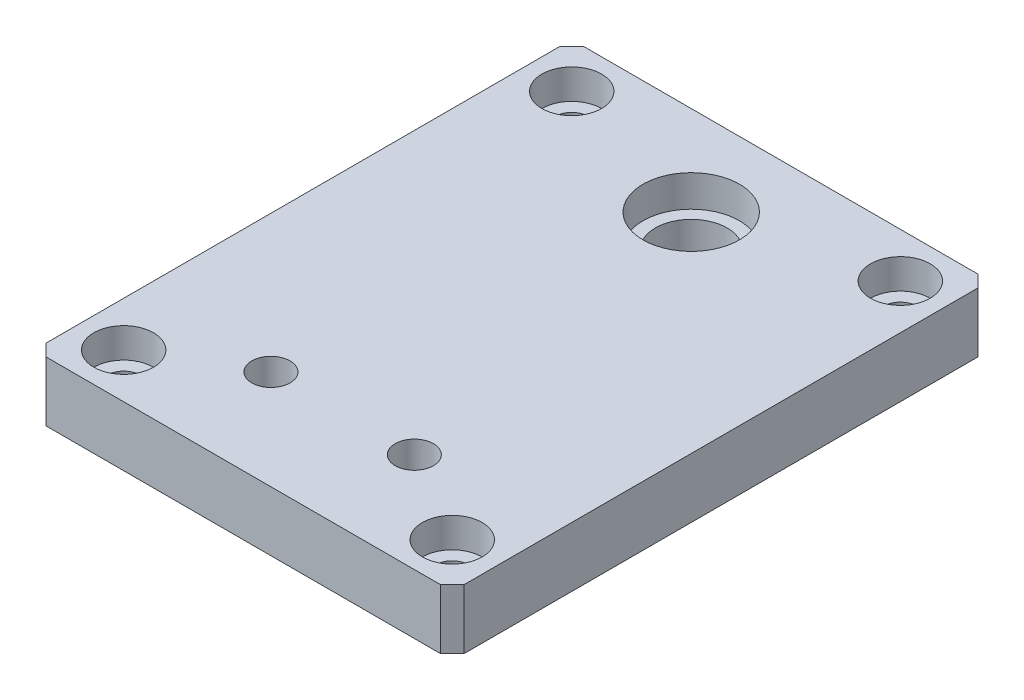
ISO-10303-21;
HEADER;
FILE_DESCRIPTION(('STEP AP214'),'2;1');
FILE_NAME('part.step','',(''),(''),'','','');
FILE_SCHEMA(('AUTOMOTIVE_DESIGN { 1 0 10303 214 1 1 1 1 }'));
ENDSEC;
DATA;
#1=APPLICATION_CONTEXT('core data for automotive mechanical design processes');
#2=APPLICATION_PROTOCOL_DEFINITION('international standard','automotive_design',2000,#1);
#3=PRODUCT_CONTEXT('',#1,'mechanical');
#4=PRODUCT('Part','Part','',(#3));
#5=PRODUCT_RELATED_PRODUCT_CATEGORY('part','',(#4));
#6=PRODUCT_DEFINITION_FORMATION('','',#4);
#7=PRODUCT_DEFINITION_CONTEXT('part definition',#1,'design');
#8=PRODUCT_DEFINITION('design','',#6,#7);
#9=PRODUCT_DEFINITION_SHAPE('','',#8);
#10=(LENGTH_UNIT() NAMED_UNIT(*) SI_UNIT(.MILLI.,.METRE.));
#11=(NAMED_UNIT(*) PLANE_ANGLE_UNIT() SI_UNIT($,.RADIAN.));
#12=(NAMED_UNIT(*) SI_UNIT($,.STERADIAN.) SOLID_ANGLE_UNIT());
#13=UNCERTAINTY_MEASURE_WITH_UNIT(LENGTH_MEASURE(1.E-05),#10,'distance_accuracy_value','');
#14=(GEOMETRIC_REPRESENTATION_CONTEXT(3) GLOBAL_UNCERTAINTY_ASSIGNED_CONTEXT((#13)) GLOBAL_UNIT_ASSIGNED_CONTEXT((#10,
#11,#12)) REPRESENTATION_CONTEXT('',''));
#15=CARTESIAN_POINT('',(0.,0.,0.));
#16=DIRECTION('',(0.,0.,1.));
#17=DIRECTION('',(1.,0.,0.));
#18=AXIS2_PLACEMENT_3D('',#15,#16,#17);
#19=CARTESIAN_POINT('',(35.,10.,45.));
#20=DIRECTION('',(-1.,0.,0.));
#21=DIRECTION('',(0.,0.,1.));
#22=AXIS2_PLACEMENT_3D('',#19,#20,#21);
#23=PLANE('',#22);
#24=DIRECTION('',(0.,0.,-1.));
#25=VECTOR('',#24,1.);
#26=CARTESIAN_POINT('',(35.,10.,45.));
#27=LINE('',#26,#25);
#28=CARTESIAN_POINT('',(35.,10.,43.));
#29=VERTEX_POINT('',#28);
#30=CARTESIAN_POINT('',(35.,10.,-43.));
#31=VERTEX_POINT('',#30);
#32=EDGE_CURVE('E127',#29,#31,#27,.T.);
#33=ORIENTED_EDGE('',*,*,#32,.F.);
#34=DIRECTION('',(0.,-1.,0.));
#35=VECTOR('',#34,1.);
#36=CARTESIAN_POINT('',(35.,10.,43.));
#37=LINE('',#36,#35);
#38=CARTESIAN_POINT('',(35.,0.,43.));
#39=VERTEX_POINT('',#38);
#40=EDGE_CURVE('E112',#29,#39,#37,.T.);
#41=ORIENTED_EDGE('',*,*,#40,.T.);
#42=DIRECTION('',(0.,0.,-1.));
#43=VECTOR('',#42,1.);
#44=CARTESIAN_POINT('',(35.,0.,45.));
#45=LINE('',#44,#43);
#46=CARTESIAN_POINT('',(35.,0.,-43.));
#47=VERTEX_POINT('',#46);
#48=EDGE_CURVE('E124',#39,#47,#45,.T.);
#49=ORIENTED_EDGE('',*,*,#48,.T.);
#50=DIRECTION('',(0.,1.,0.));
#51=VECTOR('',#50,1.);
#52=CARTESIAN_POINT('',(35.,10.,-43.));
#53=LINE('',#52,#51);
#54=EDGE_CURVE('E129',#47,#31,#53,.T.);
#55=ORIENTED_EDGE('',*,*,#54,.T.);
#56=EDGE_LOOP('',(#33,#41,#49,#55));
#57=FACE_BOUND('',#56,.T.);
#58=ADVANCED_FACE('F41',(#57),#23,.F.);
#59=CARTESIAN_POINT('',(-35.,10.,-45.));
#60=DIRECTION('',(0.,0.,1.));
#61=DIRECTION('',(1.,0.,0.));
#62=AXIS2_PLACEMENT_3D('',#59,#60,#61);
#63=PLANE('',#62);
#64=DIRECTION('',(-1.,0.,0.));
#65=VECTOR('',#64,1.);
#66=CARTESIAN_POINT('',(-35.,10.,-45.));
#67=LINE('',#66,#65);
#68=CARTESIAN_POINT('',(33.,10.,-45.));
#69=VERTEX_POINT('',#68);
#70=CARTESIAN_POINT('',(-33.,10.,-45.));
#71=VERTEX_POINT('',#70);
#72=EDGE_CURVE('E173',#69,#71,#67,.T.);
#73=ORIENTED_EDGE('',*,*,#72,.F.);
#74=DIRECTION('',(0.,-1.,0.));
#75=VECTOR('',#74,1.);
#76=CARTESIAN_POINT('',(33.,10.,-45.));
#77=LINE('',#76,#75);
#78=CARTESIAN_POINT('',(33.,0.,-45.));
#79=VERTEX_POINT('',#78);
#80=EDGE_CURVE('E166',#69,#79,#77,.T.);
#81=ORIENTED_EDGE('',*,*,#80,.T.);
#82=DIRECTION('',(-1.,0.,0.));
#83=VECTOR('',#82,1.);
#84=CARTESIAN_POINT('',(-35.,0.,-45.));
#85=LINE('',#84,#83);
#86=CARTESIAN_POINT('',(-33.,0.,-45.));
#87=VERTEX_POINT('',#86);
#88=EDGE_CURVE('E133',#79,#87,#85,.T.);
#89=ORIENTED_EDGE('',*,*,#88,.T.);
#90=DIRECTION('',(0.,1.,0.));
#91=VECTOR('',#90,1.);
#92=CARTESIAN_POINT('',(-33.,10.,-45.));
#93=LINE('',#92,#91);
#94=EDGE_CURVE('E164',#87,#71,#93,.T.);
#95=ORIENTED_EDGE('',*,*,#94,.T.);
#96=EDGE_LOOP('',(#73,#81,#89,#95));
#97=FACE_BOUND('',#96,.T.);
#98=ADVANCED_FACE('F171',(#97),#63,.F.);
#99=CARTESIAN_POINT('',(-35.,10.,45.));
#100=DIRECTION('',(1.,0.,0.));
#101=DIRECTION('',(0.,0.,-1.));
#102=AXIS2_PLACEMENT_3D('',#99,#100,#101);
#103=PLANE('',#102);
#104=DIRECTION('',(0.,0.,1.));
#105=VECTOR('',#104,1.);
#106=CARTESIAN_POINT('',(-35.,10.,45.));
#107=LINE('',#106,#105);
#108=CARTESIAN_POINT('',(-35.,10.,-43.));
#109=VERTEX_POINT('',#108);
#110=CARTESIAN_POINT('',(-35.,10.,43.));
#111=VERTEX_POINT('',#110);
#112=EDGE_CURVE('E181',#109,#111,#107,.T.);
#113=ORIENTED_EDGE('',*,*,#112,.F.);
#114=DIRECTION('',(0.,-1.,0.));
#115=VECTOR('',#114,1.);
#116=CARTESIAN_POINT('',(-35.,10.,-43.));
#117=LINE('',#116,#115);
#118=CARTESIAN_POINT('',(-35.,0.,-43.));
#119=VERTEX_POINT('',#118);
#120=EDGE_CURVE('E11',#109,#119,#117,.T.);
#121=ORIENTED_EDGE('',*,*,#120,.T.);
#122=DIRECTION('',(0.,0.,1.));
#123=VECTOR('',#122,1.);
#124=CARTESIAN_POINT('',(-35.,0.,45.));
#125=LINE('',#124,#123);
#126=CARTESIAN_POINT('',(-35.,0.,43.));
#127=VERTEX_POINT('',#126);
#128=EDGE_CURVE('E137',#119,#127,#125,.T.);
#129=ORIENTED_EDGE('',*,*,#128,.T.);
#130=DIRECTION('',(0.,1.,0.));
#131=VECTOR('',#130,1.);
#132=CARTESIAN_POINT('',(-35.,10.,43.));
#133=LINE('',#132,#131);
#134=EDGE_CURVE('E50',#127,#111,#133,.T.);
#135=ORIENTED_EDGE('',*,*,#134,.T.);
#136=EDGE_LOOP('',(#113,#121,#129,#135));
#137=FACE_BOUND('',#136,.T.);
#138=ADVANCED_FACE('F180',(#137),#103,.F.);
#139=CARTESIAN_POINT('',(-35.,10.,45.));
#140=DIRECTION('',(0.,0.,-1.));
#141=DIRECTION('',(-1.,0.,0.));
#142=AXIS2_PLACEMENT_3D('',#139,#140,#141);
#143=PLANE('',#142);
#144=DIRECTION('',(1.,0.,0.));
#145=VECTOR('',#144,1.);
#146=CARTESIAN_POINT('',(-35.,0.,45.));
#147=LINE('',#146,#145);
#148=CARTESIAN_POINT('',(-33.,0.,45.));
#149=VERTEX_POINT('',#148);
#150=CARTESIAN_POINT('',(33.,0.,45.));
#151=VERTEX_POINT('',#150);
#152=EDGE_CURVE('E147',#149,#151,#147,.T.);
#153=ORIENTED_EDGE('',*,*,#152,.T.);
#154=DIRECTION('',(0.,1.,0.));
#155=VECTOR('',#154,1.);
#156=CARTESIAN_POINT('',(33.,10.,45.));
#157=LINE('',#156,#155);
#158=CARTESIAN_POINT('',(33.,10.,45.));
#159=VERTEX_POINT('',#158);
#160=EDGE_CURVE('E113',#151,#159,#157,.T.);
#161=ORIENTED_EDGE('',*,*,#160,.T.);
#162=DIRECTION('',(1.,0.,0.));
#163=VECTOR('',#162,1.);
#164=CARTESIAN_POINT('',(-35.,10.,45.));
#165=LINE('',#164,#163);
#166=CARTESIAN_POINT('',(-33.,10.,45.));
#167=VERTEX_POINT('',#166);
#168=EDGE_CURVE('E143',#167,#159,#165,.T.);
#169=ORIENTED_EDGE('',*,*,#168,.F.);
#170=DIRECTION('',(0.,-1.,0.));
#171=VECTOR('',#170,1.);
#172=CARTESIAN_POINT('',(-33.,10.,45.));
#173=LINE('',#172,#171);
#174=EDGE_CURVE('E118',#167,#149,#173,.T.);
#175=ORIENTED_EDGE('',*,*,#174,.T.);
#176=EDGE_LOOP('',(#153,#161,#169,#175));
#177=FACE_BOUND('',#176,.T.);
#178=ADVANCED_FACE('F268',(#177),#143,.F.);
#179=CARTESIAN_POINT('',(0.,10.,0.));
#180=DIRECTION('',(0.,-1.,0.));
#181=DIRECTION('',(0.,0.,-1.));
#182=AXIS2_PLACEMENT_3D('',#179,#180,#181);
#183=PLANE('',#182);
#184=CARTESIAN_POINT('',(12.,10.,28.35));
#185=DIRECTION('',(0.,1.,0.));
#186=DIRECTION('',(0.,0.,1.));
#187=AXIS2_PLACEMENT_3D('',#184,#185,#186);
#188=CIRCLE('',#187,3.2);
#189=CARTESIAN_POINT('',(12.,10.,31.55));
#190=VERTEX_POINT('',#189);
#191=EDGE_CURVE('E250',#190,#190,#188,.T.);
#192=ORIENTED_EDGE('',*,*,#191,.F.);
#193=EDGE_LOOP('',(#192));
#194=FACE_BOUND('',#193,.T.);
#195=CARTESIAN_POINT('',(-12.,10.,28.35));
#196=DIRECTION('',(0.,1.,0.));
#197=DIRECTION('',(0.,0.,1.));
#198=AXIS2_PLACEMENT_3D('',#195,#196,#197);
#199=CIRCLE('',#198,3.2);
#200=CARTESIAN_POINT('',(-12.,10.,31.55));
#201=VERTEX_POINT('',#200);
#202=EDGE_CURVE('E247',#201,#201,#199,.T.);
#203=ORIENTED_EDGE('',*,*,#202,.F.);
#204=EDGE_LOOP('',(#203));
#205=FACE_BOUND('',#204,.T.);
#206=CARTESIAN_POINT('',(0.,10.,-30.));
#207=DIRECTION('',(0.,1.,0.));
#208=DIRECTION('',(0.,0.,1.));
#209=AXIS2_PLACEMENT_3D('',#206,#207,#208);
#210=CIRCLE('',#209,8.075);
#211=CARTESIAN_POINT('',(0.,10.,-21.925));
#212=VERTEX_POINT('',#211);
#213=EDGE_CURVE('E234',#212,#212,#210,.T.);
#214=ORIENTED_EDGE('',*,*,#213,.F.);
#215=EDGE_LOOP('',(#214));
#216=FACE_BOUND('',#215,.T.);
#217=CARTESIAN_POINT('',(-27.5,10.,37.5));
#218=DIRECTION('',(0.,1.,0.));
#219=DIRECTION('',(0.,0.,1.));
#220=AXIS2_PLACEMENT_3D('',#217,#218,#219);
#221=CIRCLE('',#220,5.);
#222=CARTESIAN_POINT('',(-27.5,10.,42.5));
#223=VERTEX_POINT('',#222);
#224=EDGE_CURVE('E228',#223,#223,#221,.T.);
#225=ORIENTED_EDGE('',*,*,#224,.F.);
#226=EDGE_LOOP('',(#225));
#227=FACE_BOUND('',#226,.T.);
#228=CARTESIAN_POINT('',(-27.5,10.,-37.5));
#229=DIRECTION('',(0.,1.,0.));
#230=DIRECTION('',(0.,0.,1.));
#231=AXIS2_PLACEMENT_3D('',#228,#229,#230);
#232=CIRCLE('',#231,5.);
#233=CARTESIAN_POINT('',(-27.5,10.,-32.5));
#234=VERTEX_POINT('',#233);
#235=EDGE_CURVE('E216',#234,#234,#232,.T.);
#236=ORIENTED_EDGE('',*,*,#235,.F.);
#237=EDGE_LOOP('',(#236));
#238=FACE_BOUND('',#237,.T.);
#239=CARTESIAN_POINT('',(27.5,10.,-37.5));
#240=DIRECTION('',(0.,1.,0.));
#241=DIRECTION('',(0.,0.,1.));
#242=AXIS2_PLACEMENT_3D('',#239,#240,#241);
#243=CIRCLE('',#242,5.);
#244=CARTESIAN_POINT('',(27.5,10.,-32.5));
#245=VERTEX_POINT('',#244);
#246=EDGE_CURVE('E204',#245,#245,#243,.T.);
#247=ORIENTED_EDGE('',*,*,#246,.F.);
#248=EDGE_LOOP('',(#247));
#249=FACE_BOUND('',#248,.T.);
#250=CARTESIAN_POINT('',(27.5,10.,37.5));
#251=DIRECTION('',(0.,1.,0.));
#252=DIRECTION('',(0.,0.,1.));
#253=AXIS2_PLACEMENT_3D('',#250,#251,#252);
#254=CIRCLE('',#253,5.);
#255=CARTESIAN_POINT('',(27.5,10.,42.5));
#256=VERTEX_POINT('',#255);
#257=EDGE_CURVE('E192',#256,#256,#254,.T.);
#258=ORIENTED_EDGE('',*,*,#257,.F.);
#259=EDGE_LOOP('',(#258));
#260=FACE_BOUND('',#259,.T.);
#261=ORIENTED_EDGE('',*,*,#168,.T.);
#262=DIRECTION('',(-0.70710678118655,0.,0.707106781186545));
#263=VECTOR('',#262,1.);
#264=CARTESIAN_POINT('',(35.,10.,43.));
#265=LINE('',#264,#263);
#266=EDGE_CURVE('E162',#159,#29,#265,.F.);
#267=ORIENTED_EDGE('',*,*,#266,.T.);
#268=ORIENTED_EDGE('',*,*,#32,.T.);
#269=DIRECTION('',(0.707106781186545,0.,0.70710678118655));
#270=VECTOR('',#269,1.);
#271=CARTESIAN_POINT('',(33.,10.,-45.));
#272=LINE('',#271,#270);
#273=EDGE_CURVE('E160',#31,#69,#272,.F.);
#274=ORIENTED_EDGE('',*,*,#273,.T.);
#275=ORIENTED_EDGE('',*,*,#72,.T.);
#276=DIRECTION('',(0.70710678118655,0.,-0.707106781186545));
#277=VECTOR('',#276,1.);
#278=CARTESIAN_POINT('',(-35.,10.,-43.));
#279=LINE('',#278,#277);
#280=EDGE_CURVE('E63',#71,#109,#279,.F.);
#281=ORIENTED_EDGE('',*,*,#280,.T.);
#282=ORIENTED_EDGE('',*,*,#112,.T.);
#283=DIRECTION('',(-0.707106781186545,0.,-0.70710678118655));
#284=VECTOR('',#283,1.);
#285=CARTESIAN_POINT('',(-33.,10.,45.));
#286=LINE('',#285,#284);
#287=EDGE_CURVE('E157',#111,#167,#286,.F.);
#288=ORIENTED_EDGE('',*,*,#287,.T.);
#289=EDGE_LOOP('',(#261,#267,#268,#274,#275,#281,#282,#288));
#290=FACE_BOUND('',#289,.T.);
#291=ADVANCED_FACE('F265',(#194,#205,#216,#227,#238,#249,#260,#290),#183,.F.);
#292=CARTESIAN_POINT('',(0.,0.,0.));
#293=DIRECTION('',(0.,-1.,0.));
#294=DIRECTION('',(0.,0.,-1.));
#295=AXIS2_PLACEMENT_3D('',#292,#293,#294);
#296=PLANE('',#295);
#297=CARTESIAN_POINT('',(12.,0.,28.35));
#298=DIRECTION('',(0.,1.,0.));
#299=DIRECTION('',(0.,0.,1.));
#300=AXIS2_PLACEMENT_3D('',#297,#298,#299);
#301=CIRCLE('',#300,3.2);
#302=CARTESIAN_POINT('',(12.,0.,31.55));
#303=VERTEX_POINT('',#302);
#304=EDGE_CURVE('E243',#303,#303,#301,.T.);
#305=ORIENTED_EDGE('',*,*,#304,.T.);
#306=EDGE_LOOP('',(#305));
#307=FACE_BOUND('',#306,.T.);
#308=CARTESIAN_POINT('',(-12.,0.,28.35));
#309=DIRECTION('',(0.,1.,0.));
#310=DIRECTION('',(0.,0.,1.));
#311=AXIS2_PLACEMENT_3D('',#308,#309,#310);
#312=CIRCLE('',#311,3.2);
#313=CARTESIAN_POINT('',(-12.,0.,31.55));
#314=VERTEX_POINT('',#313);
#315=EDGE_CURVE('E244',#314,#314,#312,.T.);
#316=ORIENTED_EDGE('',*,*,#315,.T.);
#317=EDGE_LOOP('',(#316));
#318=FACE_BOUND('',#317,.T.);
#319=CARTESIAN_POINT('',(0.,0.,-30.));
#320=DIRECTION('',(0.,1.,0.));
#321=DIRECTION('',(0.,0.,1.));
#322=AXIS2_PLACEMENT_3D('',#319,#320,#321);
#323=CIRCLE('',#322,6.);
#324=CARTESIAN_POINT('',(0.,0.,-24.));
#325=VERTEX_POINT('',#324);
#326=EDGE_CURVE('E237',#325,#325,#323,.T.);
#327=ORIENTED_EDGE('',*,*,#326,.T.);
#328=EDGE_LOOP('',(#327));
#329=FACE_BOUND('',#328,.T.);
#330=CARTESIAN_POINT('',(-27.5,0.,37.5));
#331=DIRECTION('',(0.,1.,0.));
#332=DIRECTION('',(0.,0.,1.));
#333=AXIS2_PLACEMENT_3D('',#330,#331,#332);
#334=CIRCLE('',#333,2.75000000000001);
#335=CARTESIAN_POINT('',(-27.5,0.,40.25));
#336=VERTEX_POINT('',#335);
#337=EDGE_CURVE('E219',#336,#336,#334,.T.);
#338=ORIENTED_EDGE('',*,*,#337,.T.);
#339=EDGE_LOOP('',(#338));
#340=FACE_BOUND('',#339,.T.);
#341=CARTESIAN_POINT('',(-27.5,0.,-37.5));
#342=DIRECTION('',(0.,1.,0.));
#343=DIRECTION('',(0.,0.,1.));
#344=AXIS2_PLACEMENT_3D('',#341,#342,#343);
#345=CIRCLE('',#344,2.75000000000001);
#346=CARTESIAN_POINT('',(-27.5,0.,-34.75));
#347=VERTEX_POINT('',#346);
#348=EDGE_CURVE('E207',#347,#347,#345,.T.);
#349=ORIENTED_EDGE('',*,*,#348,.T.);
#350=EDGE_LOOP('',(#349));
#351=FACE_BOUND('',#350,.T.);
#352=CARTESIAN_POINT('',(27.5,0.,-37.5));
#353=DIRECTION('',(0.,1.,0.));
#354=DIRECTION('',(0.,0.,1.));
#355=AXIS2_PLACEMENT_3D('',#352,#353,#354);
#356=CIRCLE('',#355,2.75000000000001);
#357=CARTESIAN_POINT('',(27.5,0.,-34.75));
#358=VERTEX_POINT('',#357);
#359=EDGE_CURVE('E195',#358,#358,#356,.T.);
#360=ORIENTED_EDGE('',*,*,#359,.T.);
#361=EDGE_LOOP('',(#360));
#362=FACE_BOUND('',#361,.T.);
#363=CARTESIAN_POINT('',(27.5,0.,37.5));
#364=DIRECTION('',(0.,1.,0.));
#365=DIRECTION('',(0.,0.,1.));
#366=AXIS2_PLACEMENT_3D('',#363,#364,#365);
#367=CIRCLE('',#366,2.75000000000001);
#368=CARTESIAN_POINT('',(27.5,0.,40.25));
#369=VERTEX_POINT('',#368);
#370=EDGE_CURVE('E134',#369,#369,#367,.T.);
#371=ORIENTED_EDGE('',*,*,#370,.T.);
#372=EDGE_LOOP('',(#371));
#373=FACE_BOUND('',#372,.T.);
#374=ORIENTED_EDGE('',*,*,#48,.F.);
#375=DIRECTION('',(0.70710678118655,0.,-0.707106781186545));
#376=VECTOR('',#375,1.);
#377=CARTESIAN_POINT('',(38.9999999999999,0.,39.0000000000001));
#378=LINE('',#377,#376);
#379=EDGE_CURVE('E108',#39,#151,#378,.F.);
#380=ORIENTED_EDGE('',*,*,#379,.T.);
#381=ORIENTED_EDGE('',*,*,#152,.F.);
#382=DIRECTION('',(0.707106781186545,0.,0.70710678118655));
#383=VECTOR('',#382,1.);
#384=CARTESIAN_POINT('',(-39.0000000000001,0.,38.9999999999998));
#385=LINE('',#384,#383);
#386=EDGE_CURVE('E128',#149,#127,#385,.F.);
#387=ORIENTED_EDGE('',*,*,#386,.T.);
#388=ORIENTED_EDGE('',*,*,#128,.F.);
#389=DIRECTION('',(-0.70710678118655,0.,0.707106781186545));
#390=VECTOR('',#389,1.);
#391=CARTESIAN_POINT('',(-38.9999999999999,0.,-39.0000000000001));
#392=LINE('',#391,#390);
#393=EDGE_CURVE('E151',#119,#87,#392,.F.);
#394=ORIENTED_EDGE('',*,*,#393,.T.);
#395=ORIENTED_EDGE('',*,*,#88,.F.);
#396=DIRECTION('',(-0.707106781186545,0.,-0.70710678118655));
#397=VECTOR('',#396,1.);
#398=CARTESIAN_POINT('',(39.0000000000001,0.,-38.9999999999999));
#399=LINE('',#398,#397);
#400=EDGE_CURVE('E119',#79,#47,#399,.F.);
#401=ORIENTED_EDGE('',*,*,#400,.T.);
#402=EDGE_LOOP('',(#374,#380,#381,#387,#388,#394,#395,#401));
#403=FACE_BOUND('',#402,.T.);
#404=ADVANCED_FACE('F131',(#307,#318,#329,#340,#351,#362,#373,#403),#296,.T.);
#405=CARTESIAN_POINT('',(27.5,10.,37.5));
#406=DIRECTION('',(0.,1.,0.));
#407=DIRECTION('',(0.,0.,1.));
#408=AXIS2_PLACEMENT_3D('',#405,#406,#407);
#409=CYLINDRICAL_SURFACE('',#408,2.75);
#410=ORIENTED_EDGE('',*,*,#370,.F.);
#411=EDGE_LOOP('',(#410));
#412=FACE_BOUND('',#411,.T.);
#413=CARTESIAN_POINT('',(27.5,5.,37.5));
#414=DIRECTION('',(0.,1.,0.));
#415=DIRECTION('',(0.,0.,1.));
#416=AXIS2_PLACEMENT_3D('',#413,#414,#415);
#417=CIRCLE('',#416,2.75);
#418=CARTESIAN_POINT('',(27.5,5.,40.25));
#419=VERTEX_POINT('',#418);
#420=EDGE_CURVE('E140',#419,#419,#417,.T.);
#421=ORIENTED_EDGE('',*,*,#420,.T.);
#422=EDGE_LOOP('',(#421));
#423=FACE_BOUND('',#422,.T.);
#424=ADVANCED_FACE('F471',(#412,#423),#409,.F.);
#425=CARTESIAN_POINT('',(30.25,5.,37.5));
#426=DIRECTION('',(0.,-1.,0.));
#427=DIRECTION('',(0.,0.,-1.));
#428=AXIS2_PLACEMENT_3D('',#425,#426,#427);
#429=PLANE('',#428);
#430=ORIENTED_EDGE('',*,*,#420,.F.);
#431=EDGE_LOOP('',(#430));
#432=FACE_BOUND('',#431,.T.);
#433=CARTESIAN_POINT('',(27.5,5.,37.5));
#434=DIRECTION('',(0.,1.,0.));
#435=DIRECTION('',(0.,0.,1.));
#436=AXIS2_PLACEMENT_3D('',#433,#434,#435);
#437=CIRCLE('',#436,5.);
#438=CARTESIAN_POINT('',(27.5,5.,42.5));
#439=VERTEX_POINT('',#438);
#440=EDGE_CURVE('E189',#439,#439,#437,.T.);
#441=ORIENTED_EDGE('',*,*,#440,.T.);
#442=EDGE_LOOP('',(#441));
#443=FACE_BOUND('',#442,.T.);
#444=ADVANCED_FACE('F462',(#432,#443),#429,.F.);
#445=CARTESIAN_POINT('',(27.5,10.,37.5));
#446=DIRECTION('',(0.,1.,0.));
#447=DIRECTION('',(0.,0.,1.));
#448=AXIS2_PLACEMENT_3D('',#445,#446,#447);
#449=CYLINDRICAL_SURFACE('',#448,5.);
#450=ORIENTED_EDGE('',*,*,#440,.F.);
#451=EDGE_LOOP('',(#450));
#452=FACE_BOUND('',#451,.T.);
#453=ORIENTED_EDGE('',*,*,#257,.T.);
#454=EDGE_LOOP('',(#453));
#455=FACE_BOUND('',#454,.T.);
#456=ADVANCED_FACE('F453',(#452,#455),#449,.F.);
#457=CARTESIAN_POINT('',(27.5,10.,-37.5));
#458=DIRECTION('',(0.,1.,0.));
#459=DIRECTION('',(0.,0.,1.));
#460=AXIS2_PLACEMENT_3D('',#457,#458,#459);
#461=CYLINDRICAL_SURFACE('',#460,2.75);
#462=ORIENTED_EDGE('',*,*,#359,.F.);
#463=EDGE_LOOP('',(#462));
#464=FACE_BOUND('',#463,.T.);
#465=CARTESIAN_POINT('',(27.5,5.,-37.5));
#466=DIRECTION('',(0.,1.,0.));
#467=DIRECTION('',(0.,0.,1.));
#468=AXIS2_PLACEMENT_3D('',#465,#466,#467);
#469=CIRCLE('',#468,2.75);
#470=CARTESIAN_POINT('',(27.5,5.,-34.75));
#471=VERTEX_POINT('',#470);
#472=EDGE_CURVE('E198',#471,#471,#469,.T.);
#473=ORIENTED_EDGE('',*,*,#472,.T.);
#474=EDGE_LOOP('',(#473));
#475=FACE_BOUND('',#474,.T.);
#476=ADVANCED_FACE('F444',(#464,#475),#461,.F.);
#477=CARTESIAN_POINT('',(30.25,5.,-37.5));
#478=DIRECTION('',(0.,-1.,0.));
#479=DIRECTION('',(0.,0.,-1.));
#480=AXIS2_PLACEMENT_3D('',#477,#478,#479);
#481=PLANE('',#480);
#482=ORIENTED_EDGE('',*,*,#472,.F.);
#483=EDGE_LOOP('',(#482));
#484=FACE_BOUND('',#483,.T.);
#485=CARTESIAN_POINT('',(27.5,5.,-37.5));
#486=DIRECTION('',(0.,1.,0.));
#487=DIRECTION('',(0.,0.,1.));
#488=AXIS2_PLACEMENT_3D('',#485,#486,#487);
#489=CIRCLE('',#488,5.);
#490=CARTESIAN_POINT('',(27.5,5.,-32.5));
#491=VERTEX_POINT('',#490);
#492=EDGE_CURVE('E201',#491,#491,#489,.T.);
#493=ORIENTED_EDGE('',*,*,#492,.T.);
#494=EDGE_LOOP('',(#493));
#495=FACE_BOUND('',#494,.T.);
#496=ADVANCED_FACE('F435',(#484,#495),#481,.F.);
#497=CARTESIAN_POINT('',(27.5,10.,-37.5));
#498=DIRECTION('',(0.,1.,0.));
#499=DIRECTION('',(0.,0.,1.));
#500=AXIS2_PLACEMENT_3D('',#497,#498,#499);
#501=CYLINDRICAL_SURFACE('',#500,5.);
#502=ORIENTED_EDGE('',*,*,#492,.F.);
#503=EDGE_LOOP('',(#502));
#504=FACE_BOUND('',#503,.T.);
#505=ORIENTED_EDGE('',*,*,#246,.T.);
#506=EDGE_LOOP('',(#505));
#507=FACE_BOUND('',#506,.T.);
#508=ADVANCED_FACE('F426',(#504,#507),#501,.F.);
#509=CARTESIAN_POINT('',(-27.5,10.,-37.5));
#510=DIRECTION('',(0.,1.,0.));
#511=DIRECTION('',(0.,0.,1.));
#512=AXIS2_PLACEMENT_3D('',#509,#510,#511);
#513=CYLINDRICAL_SURFACE('',#512,2.75);
#514=ORIENTED_EDGE('',*,*,#348,.F.);
#515=EDGE_LOOP('',(#514));
#516=FACE_BOUND('',#515,.T.);
#517=CARTESIAN_POINT('',(-27.5,5.,-37.5));
#518=DIRECTION('',(0.,1.,0.));
#519=DIRECTION('',(0.,0.,1.));
#520=AXIS2_PLACEMENT_3D('',#517,#518,#519);
#521=CIRCLE('',#520,2.75);
#522=CARTESIAN_POINT('',(-27.5,5.,-34.75));
#523=VERTEX_POINT('',#522);
#524=EDGE_CURVE('E210',#523,#523,#521,.T.);
#525=ORIENTED_EDGE('',*,*,#524,.T.);
#526=EDGE_LOOP('',(#525));
#527=FACE_BOUND('',#526,.T.);
#528=ADVANCED_FACE('F417',(#516,#527),#513,.F.);
#529=CARTESIAN_POINT('',(-24.75,5.,-37.5));
#530=DIRECTION('',(0.,-1.,0.));
#531=DIRECTION('',(0.,0.,-1.));
#532=AXIS2_PLACEMENT_3D('',#529,#530,#531);
#533=PLANE('',#532);
#534=ORIENTED_EDGE('',*,*,#524,.F.);
#535=EDGE_LOOP('',(#534));
#536=FACE_BOUND('',#535,.T.);
#537=CARTESIAN_POINT('',(-27.5,5.,-37.5));
#538=DIRECTION('',(0.,1.,0.));
#539=DIRECTION('',(0.,0.,1.));
#540=AXIS2_PLACEMENT_3D('',#537,#538,#539);
#541=CIRCLE('',#540,5.);
#542=CARTESIAN_POINT('',(-27.5,5.,-32.5));
#543=VERTEX_POINT('',#542);
#544=EDGE_CURVE('E213',#543,#543,#541,.T.);
#545=ORIENTED_EDGE('',*,*,#544,.T.);
#546=EDGE_LOOP('',(#545));
#547=FACE_BOUND('',#546,.T.);
#548=ADVANCED_FACE('F408',(#536,#547),#533,.F.);
#549=CARTESIAN_POINT('',(-27.5,10.,-37.5));
#550=DIRECTION('',(0.,1.,0.));
#551=DIRECTION('',(0.,0.,1.));
#552=AXIS2_PLACEMENT_3D('',#549,#550,#551);
#553=CYLINDRICAL_SURFACE('',#552,5.);
#554=ORIENTED_EDGE('',*,*,#544,.F.);
#555=EDGE_LOOP('',(#554));
#556=FACE_BOUND('',#555,.T.);
#557=ORIENTED_EDGE('',*,*,#235,.T.);
#558=EDGE_LOOP('',(#557));
#559=FACE_BOUND('',#558,.T.);
#560=ADVANCED_FACE('F399',(#556,#559),#553,.F.);
#561=CARTESIAN_POINT('',(-27.5,10.,37.5));
#562=DIRECTION('',(0.,1.,0.));
#563=DIRECTION('',(0.,0.,1.));
#564=AXIS2_PLACEMENT_3D('',#561,#562,#563);
#565=CYLINDRICAL_SURFACE('',#564,2.75);
#566=ORIENTED_EDGE('',*,*,#337,.F.);
#567=EDGE_LOOP('',(#566));
#568=FACE_BOUND('',#567,.T.);
#569=CARTESIAN_POINT('',(-27.5,5.,37.5));
#570=DIRECTION('',(0.,1.,0.));
#571=DIRECTION('',(0.,0.,1.));
#572=AXIS2_PLACEMENT_3D('',#569,#570,#571);
#573=CIRCLE('',#572,2.75);
#574=CARTESIAN_POINT('',(-27.5,5.,40.25));
#575=VERTEX_POINT('',#574);
#576=EDGE_CURVE('E222',#575,#575,#573,.T.);
#577=ORIENTED_EDGE('',*,*,#576,.T.);
#578=EDGE_LOOP('',(#577));
#579=FACE_BOUND('',#578,.T.);
#580=ADVANCED_FACE('F390',(#568,#579),#565,.F.);
#581=CARTESIAN_POINT('',(-24.75,5.,37.5));
#582=DIRECTION('',(0.,-1.,0.));
#583=DIRECTION('',(0.,0.,-1.));
#584=AXIS2_PLACEMENT_3D('',#581,#582,#583);
#585=PLANE('',#584);
#586=ORIENTED_EDGE('',*,*,#576,.F.);
#587=EDGE_LOOP('',(#586));
#588=FACE_BOUND('',#587,.T.);
#589=CARTESIAN_POINT('',(-27.5,5.,37.5));
#590=DIRECTION('',(0.,1.,0.));
#591=DIRECTION('',(0.,0.,1.));
#592=AXIS2_PLACEMENT_3D('',#589,#590,#591);
#593=CIRCLE('',#592,5.);
#594=CARTESIAN_POINT('',(-27.5,5.,42.5));
#595=VERTEX_POINT('',#594);
#596=EDGE_CURVE('E225',#595,#595,#593,.T.);
#597=ORIENTED_EDGE('',*,*,#596,.T.);
#598=EDGE_LOOP('',(#597));
#599=FACE_BOUND('',#598,.T.);
#600=ADVANCED_FACE('F381',(#588,#599),#585,.F.);
#601=CARTESIAN_POINT('',(-27.5,10.,37.5));
#602=DIRECTION('',(0.,1.,0.));
#603=DIRECTION('',(0.,0.,1.));
#604=AXIS2_PLACEMENT_3D('',#601,#602,#603);
#605=CYLINDRICAL_SURFACE('',#604,5.);
#606=ORIENTED_EDGE('',*,*,#596,.F.);
#607=EDGE_LOOP('',(#606));
#608=FACE_BOUND('',#607,.T.);
#609=ORIENTED_EDGE('',*,*,#224,.T.);
#610=EDGE_LOOP('',(#609));
#611=FACE_BOUND('',#610,.T.);
#612=ADVANCED_FACE('F372',(#608,#611),#605,.F.);
#613=CARTESIAN_POINT('',(0.,4.7,-30.));
#614=DIRECTION('',(0.,-1.,0.));
#615=DIRECTION('',(0.,0.,-1.));
#616=AXIS2_PLACEMENT_3D('',#613,#614,#615);
#617=PLANE('',#616);
#618=CARTESIAN_POINT('',(0.,4.7,-30.));
#619=DIRECTION('',(0.,1.,0.));
#620=DIRECTION('',(0.,0.,1.));
#621=AXIS2_PLACEMENT_3D('',#618,#619,#620);
#622=CIRCLE('',#621,5.99999999999999);
#623=CARTESIAN_POINT('',(0.,4.7,-24.));
#624=VERTEX_POINT('',#623);
#625=EDGE_CURVE('E240',#624,#624,#622,.T.);
#626=ORIENTED_EDGE('',*,*,#625,.F.);
#627=EDGE_LOOP('',(#626));
#628=FACE_BOUND('',#627,.T.);
#629=CARTESIAN_POINT('',(0.,4.7,-30.));
#630=DIRECTION('',(0.,1.,0.));
#631=DIRECTION('',(0.,0.,1.));
#632=AXIS2_PLACEMENT_3D('',#629,#630,#631);
#633=CIRCLE('',#632,8.075);
#634=CARTESIAN_POINT('',(0.,4.7,-21.925));
#635=VERTEX_POINT('',#634);
#636=EDGE_CURVE('E231',#635,#635,#633,.T.);
#637=ORIENTED_EDGE('',*,*,#636,.T.);
#638=EDGE_LOOP('',(#637));
#639=FACE_BOUND('',#638,.T.);
#640=ADVANCED_FACE('F363',(#628,#639),#617,.F.);
#641=CARTESIAN_POINT('',(0.,10.,-30.));
#642=DIRECTION('',(0.,1.,0.));
#643=DIRECTION('',(0.,0.,1.));
#644=AXIS2_PLACEMENT_3D('',#641,#642,#643);
#645=CYLINDRICAL_SURFACE('',#644,8.075);
#646=ORIENTED_EDGE('',*,*,#636,.F.);
#647=EDGE_LOOP('',(#646));
#648=FACE_BOUND('',#647,.T.);
#649=ORIENTED_EDGE('',*,*,#213,.T.);
#650=EDGE_LOOP('',(#649));
#651=FACE_BOUND('',#650,.T.);
#652=ADVANCED_FACE('F354',(#648,#651),#645,.F.);
#653=CARTESIAN_POINT('',(0.,4.7,-30.));
#654=DIRECTION('',(0.,1.,0.));
#655=DIRECTION('',(0.,0.,1.));
#656=AXIS2_PLACEMENT_3D('',#653,#654,#655);
#657=CYLINDRICAL_SURFACE('',#656,5.99999999999999);
#658=ORIENTED_EDGE('',*,*,#326,.F.);
#659=EDGE_LOOP('',(#658));
#660=FACE_BOUND('',#659,.T.);
#661=ORIENTED_EDGE('',*,*,#625,.T.);
#662=EDGE_LOOP('',(#661));
#663=FACE_BOUND('',#662,.T.);
#664=ADVANCED_FACE('F345',(#660,#663),#657,.F.);
#665=CARTESIAN_POINT('',(-12.,0.,28.35));
#666=DIRECTION('',(0.,1.,0.));
#667=DIRECTION('',(0.,0.,1.));
#668=AXIS2_PLACEMENT_3D('',#665,#666,#667);
#669=CYLINDRICAL_SURFACE('',#668,3.2);
#670=ORIENTED_EDGE('',*,*,#315,.F.);
#671=EDGE_LOOP('',(#670));
#672=FACE_BOUND('',#671,.T.);
#673=ORIENTED_EDGE('',*,*,#202,.T.);
#674=EDGE_LOOP('',(#673));
#675=FACE_BOUND('',#674,.T.);
#676=ADVANCED_FACE('F261',(#672,#675),#669,.F.);
#677=CARTESIAN_POINT('',(12.,0.,28.35));
#678=DIRECTION('',(0.,1.,0.));
#679=DIRECTION('',(0.,0.,1.));
#680=AXIS2_PLACEMENT_3D('',#677,#678,#679);
#681=CYLINDRICAL_SURFACE('',#680,3.2);
#682=ORIENTED_EDGE('',*,*,#304,.F.);
#683=EDGE_LOOP('',(#682));
#684=FACE_BOUND('',#683,.T.);
#685=ORIENTED_EDGE('',*,*,#191,.T.);
#686=EDGE_LOOP('',(#685));
#687=FACE_BOUND('',#686,.T.);
#688=ADVANCED_FACE('F258',(#684,#687),#681,.F.);
#689=CARTESIAN_POINT('',(35.,10.,43.));
#690=DIRECTION('',(-0.707106781186545,0.,-0.70710678118655));
#691=DIRECTION('',(0.,-1.,0.));
#692=AXIS2_PLACEMENT_3D('',#689,#690,#691);
#693=PLANE('',#692);
#694=ORIENTED_EDGE('',*,*,#266,.F.);
#695=ORIENTED_EDGE('',*,*,#160,.F.);
#696=ORIENTED_EDGE('',*,*,#379,.F.);
#697=ORIENTED_EDGE('',*,*,#40,.F.);
#698=EDGE_LOOP('',(#694,#695,#696,#697));
#699=FACE_BOUND('',#698,.T.);
#700=ADVANCED_FACE('F111',(#699),#693,.F.);
#701=CARTESIAN_POINT('',(33.,10.,-45.));
#702=DIRECTION('',(-0.70710678118655,0.,0.707106781186545));
#703=DIRECTION('',(0.,-1.,0.));
#704=AXIS2_PLACEMENT_3D('',#701,#702,#703);
#705=PLANE('',#704);
#706=ORIENTED_EDGE('',*,*,#273,.F.);
#707=ORIENTED_EDGE('',*,*,#54,.F.);
#708=ORIENTED_EDGE('',*,*,#400,.F.);
#709=ORIENTED_EDGE('',*,*,#80,.F.);
#710=EDGE_LOOP('',(#706,#707,#708,#709));
#711=FACE_BOUND('',#710,.T.);
#712=ADVANCED_FACE('F289',(#711),#705,.F.);
#713=CARTESIAN_POINT('',(-35.,10.,-43.));
#714=DIRECTION('',(0.707106781186545,0.,0.70710678118655));
#715=DIRECTION('',(0.,-1.,0.));
#716=AXIS2_PLACEMENT_3D('',#713,#714,#715);
#717=PLANE('',#716);
#718=ORIENTED_EDGE('',*,*,#280,.F.);
#719=ORIENTED_EDGE('',*,*,#94,.F.);
#720=ORIENTED_EDGE('',*,*,#393,.F.);
#721=ORIENTED_EDGE('',*,*,#120,.F.);
#722=EDGE_LOOP('',(#718,#719,#720,#721));
#723=FACE_BOUND('',#722,.T.);
#724=ADVANCED_FACE('F179',(#723),#717,.F.);
#725=CARTESIAN_POINT('',(-33.,10.,45.));
#726=DIRECTION('',(0.70710678118655,0.,-0.707106781186545));
#727=DIRECTION('',(0.,-1.,0.));
#728=AXIS2_PLACEMENT_3D('',#725,#726,#727);
#729=PLANE('',#728);
#730=ORIENTED_EDGE('',*,*,#287,.F.);
#731=ORIENTED_EDGE('',*,*,#134,.F.);
#732=ORIENTED_EDGE('',*,*,#386,.F.);
#733=ORIENTED_EDGE('',*,*,#174,.F.);
#734=EDGE_LOOP('',(#730,#731,#732,#733));
#735=FACE_BOUND('',#734,.T.);
#736=ADVANCED_FACE('F44',(#735),#729,.F.);
#737=CLOSED_SHELL('',(#58,#98,#138,#178,#291,#404,#424,#444,#456,#476,#496,#508,#528,#548,#560,
#580,#600,#612,#640,#652,#664,#676,#688,#700,#712,#724,#736));
#738=MANIFOLD_SOLID_BREP('B2',#737);
#739=ADVANCED_BREP_SHAPE_REPRESENTATION('',(#18,#738),#14);
#740=SHAPE_DEFINITION_REPRESENTATION(#9,#739);
ENDSEC;
END-ISO-10303-21;
